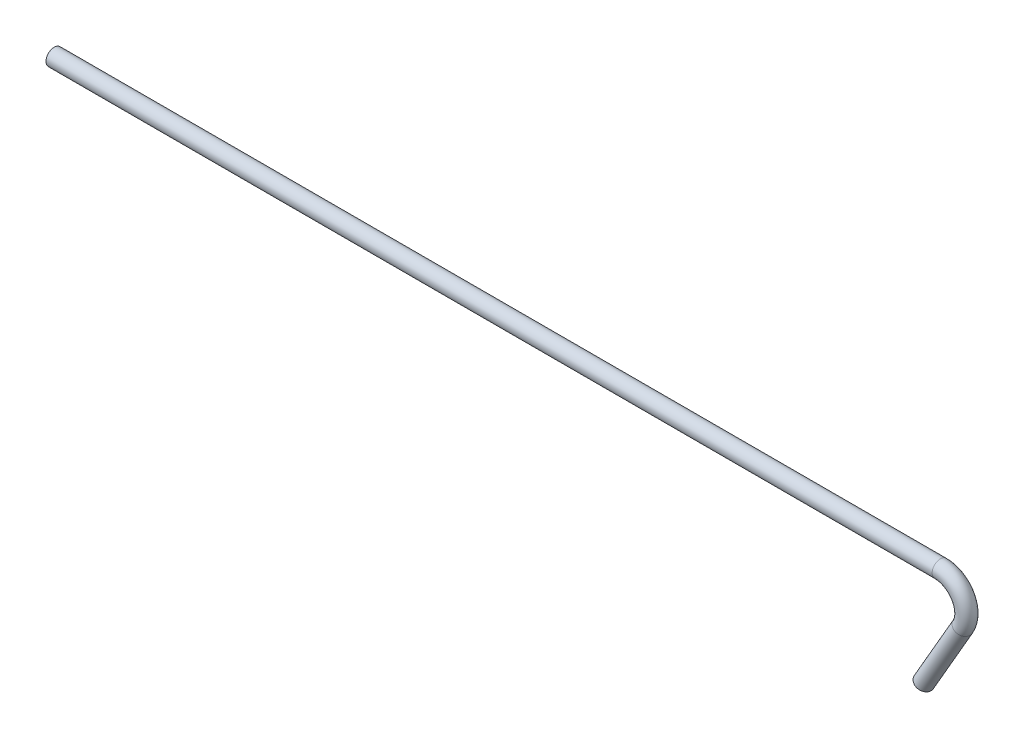
ISO-10303-21;
HEADER;
FILE_DESCRIPTION(('STEP AP214'),'2;1');
FILE_NAME('part.step','',(''),(''),'','','');
FILE_SCHEMA(('AUTOMOTIVE_DESIGN { 1 0 10303 214 1 1 1 1 }'));
ENDSEC;
DATA;
#1=APPLICATION_CONTEXT('core data for automotive mechanical design processes');
#2=APPLICATION_PROTOCOL_DEFINITION('international standard','automotive_design',2000,#1);
#3=PRODUCT_CONTEXT('',#1,'mechanical');
#4=PRODUCT('Part','Part','',(#3));
#5=PRODUCT_RELATED_PRODUCT_CATEGORY('part','',(#4));
#6=PRODUCT_DEFINITION_FORMATION('','',#4);
#7=PRODUCT_DEFINITION_CONTEXT('part definition',#1,'design');
#8=PRODUCT_DEFINITION('design','',#6,#7);
#9=PRODUCT_DEFINITION_SHAPE('','',#8);
#10=(LENGTH_UNIT() NAMED_UNIT(*) SI_UNIT(.MILLI.,.METRE.));
#11=(NAMED_UNIT(*) PLANE_ANGLE_UNIT() SI_UNIT($,.RADIAN.));
#12=(NAMED_UNIT(*) SI_UNIT($,.STERADIAN.) SOLID_ANGLE_UNIT());
#13=UNCERTAINTY_MEASURE_WITH_UNIT(LENGTH_MEASURE(1.E-05),#10,'distance_accuracy_value','');
#14=(GEOMETRIC_REPRESENTATION_CONTEXT(3) GLOBAL_UNCERTAINTY_ASSIGNED_CONTEXT((#13)) GLOBAL_UNIT_ASSIGNED_CONTEXT((#10,
#11,#12)) REPRESENTATION_CONTEXT('',''));
#15=CARTESIAN_POINT('',(0.,0.,0.));
#16=DIRECTION('',(0.,0.,1.));
#17=DIRECTION('',(1.,0.,0.));
#18=AXIS2_PLACEMENT_3D('',#15,#16,#17);
#19=CARTESIAN_POINT('',(221.399261314031,-9.52500000000001,0.));
#20=DIRECTION('',(-0.500000000000005,-0.866025403784436,0.));
#21=DIRECTION('',(0.866025403784436,-0.500000000000005,0.));
#22=AXIS2_PLACEMENT_3D('',#19,#20,#21);
#23=CYLINDRICAL_SURFACE('',#22,2.);
#24=CARTESIAN_POINT('',(221.399261314031,-9.52500000000001,0.));
#25=DIRECTION('',(-0.500000000000004,-0.866025403784436,0.));
#26=DIRECTION('',(0.,0.,-1.));
#27=AXIS2_PLACEMENT_3D('',#24,#25,#26);
#28=CIRCLE('',#27,2.);
#29=CARTESIAN_POINT('',(223.1313121216,-10.525,0.));
#30=VERTEX_POINT('',#29);
#31=EDGE_CURVE('E36',#30,#30,#28,.T.);
#32=CARTESIAN_POINT('',(211.899261314031,-25.9794826719043,0.));
#33=DIRECTION('',(-0.500000000000004,-0.866025403784436,0.));
#34=DIRECTION('',(0.,0.,-1.));
#35=AXIS2_PLACEMENT_3D('',#32,#33,#34);
#36=CIRCLE('',#35,2.);
#37=CARTESIAN_POINT('',(213.6313121216,-26.9794826719043,0.));
#38=VERTEX_POINT('',#37);
#39=EDGE_CURVE('E10',#38,#38,#36,.T.);
#40=CARTESIAN_POINT('',(223.1313121216,-10.525,0.));
#41=CARTESIAN_POINT('',(223.032353788267,-10.6964008611657,0.));
#42=CARTESIAN_POINT('',(222.933395454933,-10.8678017223314,0.));
#43=CARTESIAN_POINT('',(222.735478788267,-11.2106034446627,0.));
#44=CARTESIAN_POINT('',(222.636520454933,-11.3820043058284,0.));
#45=CARTESIAN_POINT('',(222.438603788267,-11.7248060281597,0.));
#46=CARTESIAN_POINT('',(222.339645454933,-11.8962068893254,0.));
#47=CARTESIAN_POINT('',(222.141728788267,-12.2390086116567,0.));
#48=CARTESIAN_POINT('',(222.042770454933,-12.4104094728224,0.));
#49=CARTESIAN_POINT('',(221.844853788267,-12.7532111951537,0.));
#50=CARTESIAN_POINT('',(221.745895454933,-12.9246120563194,0.));
#51=CARTESIAN_POINT('',(221.547978788267,-13.2674137786507,0.));
#52=CARTESIAN_POINT('',(221.449020454933,-13.4388146398164,0.));
#53=CARTESIAN_POINT('',(221.251103788267,-13.7816163621477,0.));
#54=CARTESIAN_POINT('',(221.152145454933,-13.9530172233134,0.));
#55=CARTESIAN_POINT('',(220.954228788267,-14.2958189456448,0.));
#56=CARTESIAN_POINT('',(220.855270454933,-14.4672198068104,0.));
#57=CARTESIAN_POINT('',(220.657353788267,-14.8100215291418,0.));
#58=CARTESIAN_POINT('',(220.558395454933,-14.9814223903074,0.));
#59=CARTESIAN_POINT('',(220.360478788267,-15.3242241126388,0.));
#60=CARTESIAN_POINT('',(220.261520454933,-15.4956249738044,0.));
#61=CARTESIAN_POINT('',(220.063603788267,-15.8384266961358,0.));
#62=CARTESIAN_POINT('',(219.964645454933,-16.0098275573014,0.));
#63=CARTESIAN_POINT('',(219.766728788267,-16.3526292796328,0.));
#64=CARTESIAN_POINT('',(219.667770454933,-16.5240301407985,0.));
#65=CARTESIAN_POINT('',(219.469853788267,-16.8668318631298,0.));
#66=CARTESIAN_POINT('',(219.370895454933,-17.0382327242955,0.));
#67=CARTESIAN_POINT('',(219.172978788267,-17.3810344466268,0.));
#68=CARTESIAN_POINT('',(219.074020454933,-17.5524353077925,0.));
#69=CARTESIAN_POINT('',(218.876103788267,-17.8952370301238,0.));
#70=CARTESIAN_POINT('',(218.777145454933,-18.0666378912895,0.));
#71=CARTESIAN_POINT('',(218.579228788267,-18.4094396136208,0.));
#72=CARTESIAN_POINT('',(218.480270454933,-18.5808404747865,0.));
#73=CARTESIAN_POINT('',(218.282353788267,-18.9236421971178,0.));
#74=CARTESIAN_POINT('',(218.183395454933,-19.0950430582835,0.));
#75=CARTESIAN_POINT('',(217.985478788267,-19.4378447806148,0.));
#76=CARTESIAN_POINT('',(217.886520454933,-19.6092456417805,0.));
#77=CARTESIAN_POINT('',(217.688603788267,-19.9520473641119,0.));
#78=CARTESIAN_POINT('',(217.589645454933,-20.1234482252775,0.));
#79=CARTESIAN_POINT('',(217.391728788267,-20.4662499476089,0.));
#80=CARTESIAN_POINT('',(217.292770454933,-20.6376508087745,0.));
#81=CARTESIAN_POINT('',(217.094853788267,-20.9804525311059,0.));
#82=CARTESIAN_POINT('',(216.995895454933,-21.1518533922715,0.));
#83=CARTESIAN_POINT('',(216.797978788267,-21.4946551146029,0.));
#84=CARTESIAN_POINT('',(216.699020454933,-21.6660559757686,0.));
#85=CARTESIAN_POINT('',(216.501103788267,-22.0088576980999,0.));
#86=CARTESIAN_POINT('',(216.402145454933,-22.1802585592656,0.));
#87=CARTESIAN_POINT('',(216.204228788267,-22.5230602815969,0.));
#88=CARTESIAN_POINT('',(216.105270454933,-22.6944611427626,0.));
#89=CARTESIAN_POINT('',(215.907353788267,-23.0372628650939,0.));
#90=CARTESIAN_POINT('',(215.808395454933,-23.2086637262596,0.));
#91=CARTESIAN_POINT('',(215.610478788267,-23.5514654485909,0.));
#92=CARTESIAN_POINT('',(215.511520454933,-23.7228663097566,0.));
#93=CARTESIAN_POINT('',(215.313603788267,-24.0656680320879,0.));
#94=CARTESIAN_POINT('',(215.214645454933,-24.2370688932536,0.));
#95=CARTESIAN_POINT('',(215.016728788267,-24.5798706155849,0.));
#96=CARTESIAN_POINT('',(214.917770454933,-24.7512714767506,0.));
#97=CARTESIAN_POINT('',(214.719853788267,-25.0940731990819,0.));
#98=CARTESIAN_POINT('',(214.620895454933,-25.2654740602476,0.));
#99=CARTESIAN_POINT('',(214.422978788267,-25.608275782579,0.));
#100=CARTESIAN_POINT('',(214.324020454933,-25.7796766437446,0.));
#101=CARTESIAN_POINT('',(214.126103788267,-26.122478366076,0.));
#102=CARTESIAN_POINT('',(214.027145454933,-26.2938792272416,0.));
#103=CARTESIAN_POINT('',(213.829228788267,-26.636680949573,0.));
#104=CARTESIAN_POINT('',(213.730270454933,-26.8080818107386,0.));
#105=CARTESIAN_POINT('',(213.6313121216,-26.9794826719043,0.));
#106=B_SPLINE_CURVE_WITH_KNOTS('',3,(#40,#41,#42,#43,#44,#45,#46,#47,#48,#49,#50,#51,#52,#53,
#54,#55,#56,#57,#58,#59,#60,#61,#62,#63,#64,#65,#66,#67,#68,#69,#70,#71,#72,#73,#74,#75,#76,#77,
#78,#79,#80,#81,#82,#83,#84,#85,#86,#87,#88,#89,#90,#91,#92,#93,#94,#95,#96,#97,#98,#99,#100,
#101,#102,#103,#104,#105),.UNSPECIFIED.,.F.,.F.,(4,2,2,2,2,2,2,2,2,2,2,2,2,2,2,2,2,2,2,2,2,2,2,
2,2,2,2,2,2,2,2,2,4),(0.,0.593749999999999,1.1875,1.78125,2.375,2.96875,3.5625,4.15625,4.75,
5.34375,5.93750000000001,6.53125000000001,7.12500000000001,7.71875000000002,8.31250000000001,
8.90625000000001,9.50000000000001,10.09375,10.6875,11.28125,11.875,12.46875,13.0625,13.65625,
14.25,14.84375,15.4375,16.03125,16.625,17.21875,17.8125,18.40625,19.),.UNSPECIFIED.);
#107=EDGE_CURVE('BSEAM30',#30,#38,#106,.T.);
#108=ORIENTED_EDGE('',*,*,#31,.T.);
#109=ORIENTED_EDGE('',*,*,#39,.F.);
#110=ORIENTED_EDGE('',*,*,#107,.T.);
#111=ORIENTED_EDGE('',*,*,#107,.F.);
#112=EDGE_LOOP('',(#108,#110,#109,#111));
#113=FACE_BOUND('',#112,.T.);
#114=ADVANCED_FACE('F30',(#113),#23,.T.);
#115=CARTESIAN_POINT('',(215.9,-6.34999999999544,0.));
#116=DIRECTION('',(0.,0.,-1.));
#117=DIRECTION('',(-1.,0.,0.));
#118=AXIS2_PLACEMENT_3D('',#115,#116,#117);
#119=TOROIDAL_SURFACE('',#118,6.35,2.);
#120=CARTESIAN_POINT('',(215.9,4.55191440096314E-12,0.));
#121=DIRECTION('',(1.,0.,0.));
#122=DIRECTION('',(0.,0.,-1.));
#123=AXIS2_PLACEMENT_3D('',#120,#121,#122);
#124=CIRCLE('',#123,2.);
#125=CARTESIAN_POINT('',(215.9,2.00000000000456,0.));
#126=VERTEX_POINT('',#125);
#127=EDGE_CURVE('E40',#126,#126,#124,.T.);
#128=CARTESIAN_POINT('',(215.9,-6.34999999999544,0.));
#129=DIRECTION('',(0.,0.,-1.));
#130=DIRECTION('',(-1.,0.,0.));
#131=AXIS2_PLACEMENT_3D('',#128,#129,#130);
#132=CIRCLE('',#131,8.35);
#133=EDGE_CURVE('',#126,#30,#132,.T.);
#134=ORIENTED_EDGE('',*,*,#127,.T.);
#135=ORIENTED_EDGE('',*,*,#31,.F.);
#136=ORIENTED_EDGE('',*,*,#133,.T.);
#137=ORIENTED_EDGE('',*,*,#133,.F.);
#138=EDGE_LOOP('',(#134,#136,#135,#137));
#139=FACE_BOUND('',#138,.T.);
#140=ADVANCED_FACE('F62',(#139),#119,.T.);
#141=CARTESIAN_POINT('',(215.9,4.55191440096314E-12,0.));
#142=DIRECTION('',(-1.,0.,0.));
#143=DIRECTION('',(0.,0.,1.));
#144=AXIS2_PLACEMENT_3D('',#141,#142,#143);
#145=CYLINDRICAL_SURFACE('',#144,2.);
#146=ORIENTED_EDGE('',*,*,#127,.F.);
#147=EDGE_LOOP('',(#146));
#148=FACE_BOUND('',#147,.T.);
#149=CARTESIAN_POINT('',(0.,0.,0.));
#150=DIRECTION('',(1.,0.,0.));
#151=DIRECTION('',(0.,0.,-1.));
#152=AXIS2_PLACEMENT_3D('',#149,#150,#151);
#153=CIRCLE('',#152,2.);
#154=CARTESIAN_POINT('',(0.,0.,-2.));
#155=VERTEX_POINT('',#154);
#156=EDGE_CURVE('E44',#155,#155,#153,.T.);
#157=ORIENTED_EDGE('',*,*,#156,.T.);
#158=EDGE_LOOP('',(#157));
#159=FACE_BOUND('',#158,.T.);
#160=ADVANCED_FACE('F50',(#148,#159),#145,.T.);
#161=CARTESIAN_POINT('',(211.899261314031,-25.9794826719043,0.));
#162=DIRECTION('',(-0.500000000000004,-0.866025403784436,0.));
#163=DIRECTION('',(0.,0.,-1.));
#164=AXIS2_PLACEMENT_3D('',#161,#162,#163);
#165=PLANE('',#164);
#166=ORIENTED_EDGE('',*,*,#39,.T.);
#167=EDGE_LOOP('',(#166));
#168=FACE_BOUND('',#167,.T.);
#169=ADVANCED_FACE('F54',(#168),#165,.T.);
#170=CARTESIAN_POINT('',(0.,0.,0.));
#171=DIRECTION('',(1.,0.,0.));
#172=DIRECTION('',(0.,0.,-1.));
#173=AXIS2_PLACEMENT_3D('',#170,#171,#172);
#174=PLANE('',#173);
#175=ORIENTED_EDGE('',*,*,#156,.F.);
#176=EDGE_LOOP('',(#175));
#177=FACE_BOUND('',#176,.T.);
#178=ADVANCED_FACE('F52',(#177),#174,.F.);
#179=CLOSED_SHELL('',(#114,#140,#160,#169,#178));
#180=MANIFOLD_SOLID_BREP('B2',#179);
#181=ADVANCED_BREP_SHAPE_REPRESENTATION('',(#18,#180),#14);
#182=SHAPE_DEFINITION_REPRESENTATION(#9,#181);
ENDSEC;
END-ISO-10303-21;
